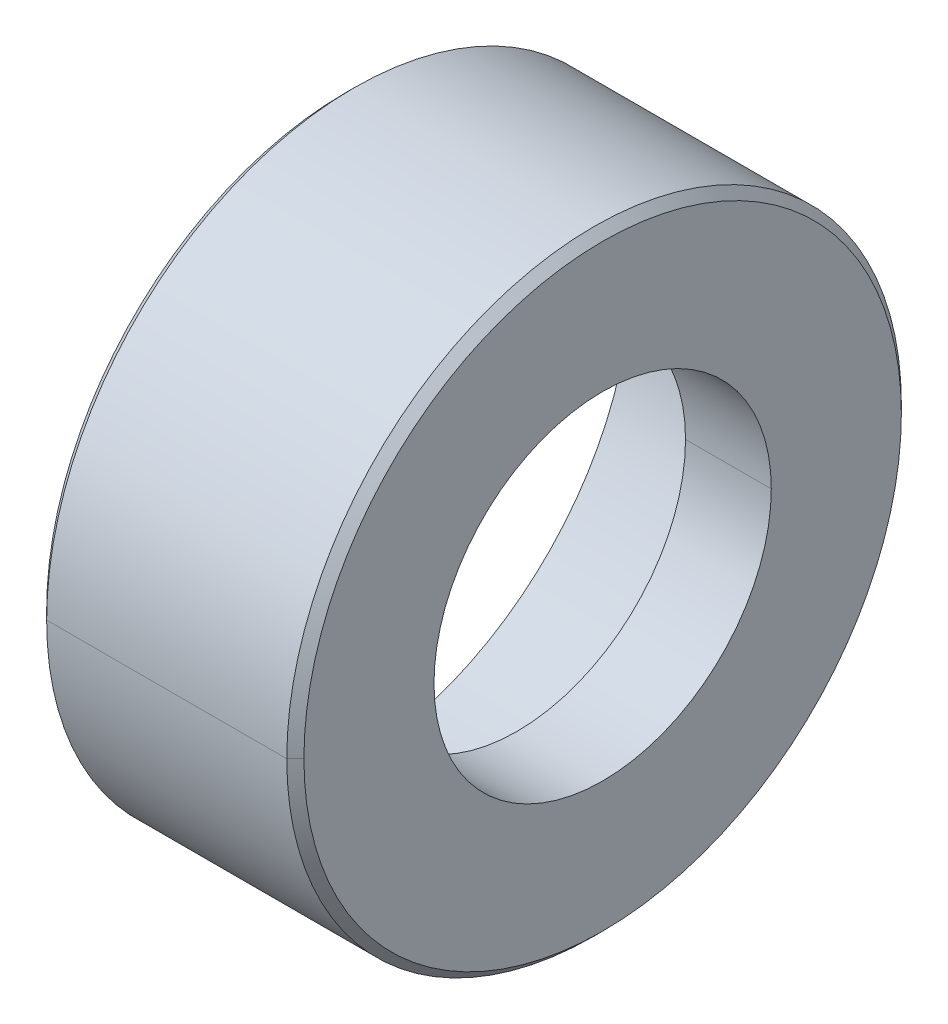
ISO-10303-21;
HEADER;
FILE_DESCRIPTION(('STEP AP214'),'2;1');
FILE_NAME('part.step','',(''),(''),'','','');
FILE_SCHEMA(('AUTOMOTIVE_DESIGN { 1 0 10303 214 1 1 1 1 }'));
ENDSEC;
DATA;
#1=APPLICATION_CONTEXT('core data for automotive mechanical design processes');
#2=APPLICATION_PROTOCOL_DEFINITION('international standard','automotive_design',2000,#1);
#3=PRODUCT_CONTEXT('',#1,'mechanical');
#4=PRODUCT('Part','Part','',(#3));
#5=PRODUCT_RELATED_PRODUCT_CATEGORY('part','',(#4));
#6=PRODUCT_DEFINITION_FORMATION('','',#4);
#7=PRODUCT_DEFINITION_CONTEXT('part definition',#1,'design');
#8=PRODUCT_DEFINITION('design','',#6,#7);
#9=PRODUCT_DEFINITION_SHAPE('','',#8);
#10=(LENGTH_UNIT() NAMED_UNIT(*) SI_UNIT(.MILLI.,.METRE.));
#11=(NAMED_UNIT(*) PLANE_ANGLE_UNIT() SI_UNIT($,.RADIAN.));
#12=(NAMED_UNIT(*) SI_UNIT($,.STERADIAN.) SOLID_ANGLE_UNIT());
#13=UNCERTAINTY_MEASURE_WITH_UNIT(LENGTH_MEASURE(1.E-05),#10,'distance_accuracy_value','');
#14=(GEOMETRIC_REPRESENTATION_CONTEXT(3) GLOBAL_UNCERTAINTY_ASSIGNED_CONTEXT((#13)) GLOBAL_UNIT_ASSIGNED_CONTEXT((#10,
#11,#12)) REPRESENTATION_CONTEXT('',''));
#15=CARTESIAN_POINT('',(0.,0.,0.));
#16=DIRECTION('',(0.,0.,1.));
#17=DIRECTION('',(1.,0.,0.));
#18=AXIS2_PLACEMENT_3D('',#15,#16,#17);
#19=CARTESIAN_POINT('',(9.00000000001464,0.,0.));
#20=DIRECTION('',(1.,0.,0.));
#21=DIRECTION('',(0.,0.,-1.));
#22=AXIS2_PLACEMENT_3D('',#19,#20,#21);
#23=CYLINDRICAL_SURFACE('',#22,5.9);
#24=DIRECTION('',(1.,0.,0.));
#25=VECTOR('',#24,1.);
#26=CARTESIAN_POINT('',(9.00000000001464,0.,5.9));
#27=LINE('',#26,#25);
#28=CARTESIAN_POINT('',(6.00000000001444,0.,5.9));
#29=VERTEX_POINT('',#28);
#30=CARTESIAN_POINT('',(9.00000000001464,0.,5.9));
#31=VERTEX_POINT('',#30);
#32=EDGE_CURVE('E108',#29,#31,#27,.T.);
#33=ORIENTED_EDGE('',*,*,#32,.F.);
#34=CARTESIAN_POINT('',(6.00000000001444,0.,0.));
#35=DIRECTION('',(1.,0.,0.));
#36=DIRECTION('',(0.,0.,-1.));
#37=AXIS2_PLACEMENT_3D('',#34,#35,#36);
#38=CIRCLE('',#37,5.9);
#39=CARTESIAN_POINT('',(6.00000000001444,0.,-5.9));
#40=VERTEX_POINT('',#39);
#41=EDGE_CURVE('E11',#40,#29,#38,.T.);
#42=ORIENTED_EDGE('',*,*,#41,.F.);
#43=DIRECTION('',(1.,0.,0.));
#44=VECTOR('',#43,1.);
#45=CARTESIAN_POINT('',(9.00000000001464,0.,-5.9));
#46=LINE('',#45,#44);
#47=CARTESIAN_POINT('',(9.00000000001464,0.,-5.9));
#48=VERTEX_POINT('',#47);
#49=EDGE_CURVE('E105',#40,#48,#46,.T.);
#50=ORIENTED_EDGE('',*,*,#49,.T.);
#51=CARTESIAN_POINT('',(9.00000000001464,0.,0.));
#52=DIRECTION('',(1.,0.,0.));
#53=DIRECTION('',(0.,0.,-1.));
#54=AXIS2_PLACEMENT_3D('',#51,#52,#53);
#55=CIRCLE('',#54,5.9);
#56=EDGE_CURVE('E21',#48,#31,#55,.T.);
#57=ORIENTED_EDGE('',*,*,#56,.T.);
#58=EDGE_LOOP('',(#33,#42,#50,#57));
#59=FACE_BOUND('',#58,.T.);
#60=ADVANCED_FACE('F17',(#59),#23,.F.);
#61=CARTESIAN_POINT('',(6.00000000001444,7.79927499549005,0.));
#62=DIRECTION('',(1.,0.,0.));
#63=DIRECTION('',(0.,1.,0.));
#64=AXIS2_PLACEMENT_3D('',#61,#62,#63);
#65=PLANE('',#64);
#66=ORIENTED_EDGE('',*,*,#41,.T.);
#67=CARTESIAN_POINT('',(6.00000000001444,0.,0.));
#68=DIRECTION('',(1.,0.,0.));
#69=DIRECTION('',(0.,0.,-1.));
#70=AXIS2_PLACEMENT_3D('',#67,#68,#69);
#71=CIRCLE('',#70,5.9);
#72=EDGE_CURVE('E114',#29,#40,#71,.T.);
#73=ORIENTED_EDGE('',*,*,#72,.T.);
#74=EDGE_LOOP('',(#66,#73));
#75=FACE_BOUND('',#74,.T.);
#76=CARTESIAN_POINT('',(6.00000000001444,-3.55272553789514E-12,0.));
#77=DIRECTION('',(-1.,0.,0.));
#78=DIRECTION('',(0.,0.,1.));
#79=AXIS2_PLACEMENT_3D('',#76,#77,#78);
#80=CIRCLE('',#79,7.7992749954936);
#81=CARTESIAN_POINT('',(6.00000000001444,-3.55272553789514E-12,7.7992749954936));
#82=VERTEX_POINT('',#81);
#83=CARTESIAN_POINT('',(6.00000000001444,-3.55177040217925E-12,-7.7992749954936));
#84=VERTEX_POINT('',#83);
#85=EDGE_CURVE('E229',#82,#84,#80,.T.);
#86=ORIENTED_EDGE('',*,*,#85,.T.);
#87=CARTESIAN_POINT('',(6.00000000001444,-3.55272553789514E-12,0.));
#88=DIRECTION('',(-1.,0.,0.));
#89=DIRECTION('',(0.,0.,1.));
#90=AXIS2_PLACEMENT_3D('',#87,#88,#89);
#91=CIRCLE('',#90,7.7992749954936);
#92=EDGE_CURVE('E28',#84,#82,#91,.T.);
#93=ORIENTED_EDGE('',*,*,#92,.T.);
#94=EDGE_LOOP('',(#86,#93));
#95=FACE_BOUND('',#94,.T.);
#96=ADVANCED_FACE('F19',(#75,#95),#65,.F.);
#97=CARTESIAN_POINT('',(-1.99999999998535,-3.55272553789514E-12,0.));
#98=DIRECTION('',(-1.,0.,0.));
#99=DIRECTION('',(0.,0.,1.));
#100=AXIS2_PLACEMENT_3D('',#97,#98,#99);
#101=CYLINDRICAL_SURFACE('',#100,7.7992749954936);
#102=DIRECTION('',(-1.,0.,0.));
#103=VECTOR('',#102,1.);
#104=CARTESIAN_POINT('',(-1.99999999998535,-3.55177040217925E-12,-7.7992749954936));
#105=LINE('',#104,#103);
#106=CARTESIAN_POINT('',(7.10000000003497,-3.55177040217925E-12,-7.7992749954936));
#107=VERTEX_POINT('',#106);
#108=EDGE_CURVE('E233',#107,#84,#105,.T.);
#109=ORIENTED_EDGE('',*,*,#108,.F.);
#110=CARTESIAN_POINT('',(7.10000000003497,-3.55272553789514E-12,0.));
#111=DIRECTION('',(-1.,0.,0.));
#112=DIRECTION('',(0.,0.,1.));
#113=AXIS2_PLACEMENT_3D('',#110,#111,#112);
#114=CIRCLE('',#113,7.7992749954936);
#115=CARTESIAN_POINT('',(7.10000000003497,-3.55272553789514E-12,7.7992749954936));
#116=VERTEX_POINT('',#115);
#117=EDGE_CURVE('E217',#107,#116,#114,.T.);
#118=ORIENTED_EDGE('',*,*,#117,.T.);
#119=DIRECTION('',(-1.,0.,0.));
#120=VECTOR('',#119,1.);
#121=CARTESIAN_POINT('',(-1.99999999998535,-3.55272553789514E-12,7.7992749954936));
#122=LINE('',#121,#120);
#123=EDGE_CURVE('E186',#116,#82,#122,.T.);
#124=ORIENTED_EDGE('',*,*,#123,.T.);
#125=ORIENTED_EDGE('',*,*,#92,.F.);
#126=EDGE_LOOP('',(#109,#118,#124,#125));
#127=FACE_BOUND('',#126,.T.);
#128=ADVANCED_FACE('F269',(#127),#101,.T.);
#129=CARTESIAN_POINT('',(7.10000000003497,9.59927499549296,0.));
#130=DIRECTION('',(1.,0.,0.));
#131=DIRECTION('',(0.,1.,0.));
#132=AXIS2_PLACEMENT_3D('',#129,#130,#131);
#133=PLANE('',#132);
#134=CARTESIAN_POINT('',(7.10000000003497,-3.55272553789514E-12,0.));
#135=DIRECTION('',(-1.,0.,0.));
#136=DIRECTION('',(0.,0.,1.));
#137=AXIS2_PLACEMENT_3D('',#134,#135,#136);
#138=CIRCLE('',#137,7.7992749954936);
#139=EDGE_CURVE('E118',#116,#107,#138,.T.);
#140=ORIENTED_EDGE('',*,*,#139,.F.);
#141=ORIENTED_EDGE('',*,*,#117,.F.);
#142=EDGE_LOOP('',(#140,#141));
#143=FACE_BOUND('',#142,.T.);
#144=CARTESIAN_POINT('',(7.10000000003497,-3.55272553789514E-12,0.));
#145=DIRECTION('',(-1.,0.,0.));
#146=DIRECTION('',(0.,0.,1.));
#147=AXIS2_PLACEMENT_3D('',#144,#145,#146);
#148=CIRCLE('',#147,9.59927499549651);
#149=CARTESIAN_POINT('',(7.10000000003497,-3.55272553789514E-12,9.59927499549651));
#150=VERTEX_POINT('',#149);
#151=CARTESIAN_POINT('',(7.10000000003497,-3.55154996575541E-12,-9.59927499549651));
#152=VERTEX_POINT('',#151);
#153=EDGE_CURVE('E215',#150,#152,#148,.T.);
#154=ORIENTED_EDGE('',*,*,#153,.T.);
#155=CARTESIAN_POINT('',(7.10000000003497,-3.55272553789514E-12,0.));
#156=DIRECTION('',(-1.,0.,0.));
#157=DIRECTION('',(0.,0.,1.));
#158=AXIS2_PLACEMENT_3D('',#155,#156,#157);
#159=CIRCLE('',#158,9.59927499549651);
#160=EDGE_CURVE('E174',#152,#150,#159,.T.);
#161=ORIENTED_EDGE('',*,*,#160,.T.);
#162=EDGE_LOOP('',(#154,#161));
#163=FACE_BOUND('',#162,.T.);
#164=ADVANCED_FACE('F276',(#143,#163),#133,.F.);
#165=CARTESIAN_POINT('',(-1.99999999998535,-3.55272553789514E-12,0.));
#166=DIRECTION('',(-1.,0.,0.));
#167=DIRECTION('',(0.,0.,1.));
#168=AXIS2_PLACEMENT_3D('',#165,#166,#167);
#169=CYLINDRICAL_SURFACE('',#168,9.59927499549651);
#170=DIRECTION('',(-1.,0.,0.));
#171=VECTOR('',#170,1.);
#172=CARTESIAN_POINT('',(-1.99999999998535,-3.55154996575541E-12,-9.59927499549651));
#173=LINE('',#172,#171);
#174=CARTESIAN_POINT('',(6.00000000001444,-3.55154996575541E-12,-9.59927499549651));
#175=VERTEX_POINT('',#174);
#176=EDGE_CURVE('E170',#152,#175,#173,.T.);
#177=ORIENTED_EDGE('',*,*,#176,.F.);
#178=ORIENTED_EDGE('',*,*,#153,.F.);
#179=DIRECTION('',(-1.,0.,0.));
#180=VECTOR('',#179,1.);
#181=CARTESIAN_POINT('',(-1.99999999998535,-3.55272553789514E-12,9.59927499549651));
#182=LINE('',#181,#180);
#183=CARTESIAN_POINT('',(6.00000000001444,-3.55272553789514E-12,9.59927499549651));
#184=VERTEX_POINT('',#183);
#185=EDGE_CURVE('E149',#150,#184,#182,.T.);
#186=ORIENTED_EDGE('',*,*,#185,.T.);
#187=CARTESIAN_POINT('',(6.00000000001444,-3.55272553789514E-12,0.));
#188=DIRECTION('',(-1.,0.,0.));
#189=DIRECTION('',(0.,0.,1.));
#190=AXIS2_PLACEMENT_3D('',#187,#188,#189);
#191=CIRCLE('',#190,9.59927499549651);
#192=EDGE_CURVE('E159',#184,#175,#191,.T.);
#193=ORIENTED_EDGE('',*,*,#192,.T.);
#194=EDGE_LOOP('',(#177,#178,#186,#193));
#195=FACE_BOUND('',#194,.T.);
#196=ADVANCED_FACE('F287',(#195),#169,.F.);
#197=CARTESIAN_POINT('',(6.00000000001444,9.99999999999635,0.));
#198=DIRECTION('',(1.,0.,0.));
#199=DIRECTION('',(0.,1.,0.));
#200=AXIS2_PLACEMENT_3D('',#197,#198,#199);
#201=PLANE('',#200);
#202=ORIENTED_EDGE('',*,*,#192,.F.);
#203=CARTESIAN_POINT('',(6.00000000001444,-3.55272553789514E-12,0.));
#204=DIRECTION('',(-1.,0.,0.));
#205=DIRECTION('',(0.,0.,1.));
#206=AXIS2_PLACEMENT_3D('',#203,#204,#205);
#207=CIRCLE('',#206,9.59927499549651);
#208=EDGE_CURVE('E154',#175,#184,#207,.T.);
#209=ORIENTED_EDGE('',*,*,#208,.F.);
#210=EDGE_LOOP('',(#202,#209));
#211=FACE_BOUND('',#210,.T.);
#212=CARTESIAN_POINT('',(6.00000000001444,-3.55272553789514E-12,0.));
#213=DIRECTION('',(-1.,0.,0.));
#214=DIRECTION('',(0.,0.,1.));
#215=AXIS2_PLACEMENT_3D('',#212,#213,#214);
#216=CIRCLE('',#215,10.);
#217=CARTESIAN_POINT('',(6.00000000001444,-3.55272553789514E-12,10.));
#218=VERTEX_POINT('',#217);
#219=CARTESIAN_POINT('',(6.00000000001444,-3.551500891096E-12,-10.));
#220=VERTEX_POINT('',#219);
#221=EDGE_CURVE('E155',#218,#220,#216,.T.);
#222=ORIENTED_EDGE('',*,*,#221,.T.);
#223=CARTESIAN_POINT('',(6.00000000001444,-3.55272553789514E-12,0.));
#224=DIRECTION('',(-1.,0.,0.));
#225=DIRECTION('',(0.,0.,1.));
#226=AXIS2_PLACEMENT_3D('',#223,#224,#225);
#227=CIRCLE('',#226,10.);
#228=EDGE_CURVE('E153',#220,#218,#227,.T.);
#229=ORIENTED_EDGE('',*,*,#228,.T.);
#230=EDGE_LOOP('',(#222,#229));
#231=FACE_BOUND('',#230,.T.);
#232=ADVANCED_FACE('F297',(#211,#231),#201,.F.);
#233=CARTESIAN_POINT('',(-1.99999999998535,-3.55272553789514E-12,0.));
#234=DIRECTION('',(-1.,0.,0.));
#235=DIRECTION('',(0.,0.,1.));
#236=AXIS2_PLACEMENT_3D('',#233,#234,#235);
#237=CYLINDRICAL_SURFACE('',#236,10.);
#238=DIRECTION('',(-1.,0.,0.));
#239=VECTOR('',#238,1.);
#240=CARTESIAN_POINT('',(-1.99999999998535,-3.551500891096E-12,-10.));
#241=LINE('',#240,#239);
#242=CARTESIAN_POINT('',(1.48769885299771E-11,-3.551500891096E-12,-10.));
#243=VERTEX_POINT('',#242);
#244=EDGE_CURVE('E148',#220,#243,#241,.T.);
#245=ORIENTED_EDGE('',*,*,#244,.F.);
#246=ORIENTED_EDGE('',*,*,#221,.F.);
#247=DIRECTION('',(-1.,0.,0.));
#248=VECTOR('',#247,1.);
#249=CARTESIAN_POINT('',(-1.99999999998535,-3.55272553789514E-12,10.));
#250=LINE('',#249,#248);
#251=CARTESIAN_POINT('',(1.48769885299771E-11,-3.55272553789514E-12,10.));
#252=VERTEX_POINT('',#251);
#253=EDGE_CURVE('E140',#218,#252,#250,.T.);
#254=ORIENTED_EDGE('',*,*,#253,.T.);
#255=CARTESIAN_POINT('',(1.48769885299771E-11,-3.55272553789514E-12,0.));
#256=DIRECTION('',(-1.,0.,0.));
#257=DIRECTION('',(0.,0.,1.));
#258=AXIS2_PLACEMENT_3D('',#255,#256,#257);
#259=CIRCLE('',#258,10.);
#260=EDGE_CURVE('E160',#252,#243,#259,.T.);
#261=ORIENTED_EDGE('',*,*,#260,.T.);
#262=EDGE_LOOP('',(#245,#246,#254,#261));
#263=FACE_BOUND('',#262,.T.);
#264=ADVANCED_FACE('F325',(#263),#237,.F.);
#265=CARTESIAN_POINT('',(1.48769826004298E-11,10.4500000000007,0.));
#266=DIRECTION('',(1.,0.,0.));
#267=DIRECTION('',(0.,1.,0.));
#268=AXIS2_PLACEMENT_3D('',#265,#266,#267);
#269=PLANE('',#268);
#270=ORIENTED_EDGE('',*,*,#260,.F.);
#271=CARTESIAN_POINT('',(1.48769885299771E-11,-3.55272553789514E-12,0.));
#272=DIRECTION('',(-1.,0.,0.));
#273=DIRECTION('',(0.,0.,1.));
#274=AXIS2_PLACEMENT_3D('',#271,#272,#273);
#275=CIRCLE('',#274,10.);
#276=EDGE_CURVE('E144',#243,#252,#275,.T.);
#277=ORIENTED_EDGE('',*,*,#276,.F.);
#278=EDGE_LOOP('',(#270,#277));
#279=FACE_BOUND('',#278,.T.);
#280=CARTESIAN_POINT('',(1.48769885299771E-11,-3.55272553789514E-12,0.));
#281=DIRECTION('',(-1.,0.,0.));
#282=DIRECTION('',(0.,0.,1.));
#283=AXIS2_PLACEMENT_3D('',#280,#281,#282);
#284=CIRCLE('',#283,10.4500000000043);
#285=CARTESIAN_POINT('',(1.48769885299771E-11,-3.55272553789514E-12,-10.4500000000043));
#286=VERTEX_POINT('',#285);
#287=CARTESIAN_POINT('',(1.48769885299771E-11,-3.55142741228805E-12,10.4500000000043));
#288=VERTEX_POINT('',#287);
#289=EDGE_CURVE('E142',#286,#288,#284,.T.);
#290=ORIENTED_EDGE('',*,*,#289,.T.);
#291=CARTESIAN_POINT('',(1.48769885299771E-11,-3.55272553789514E-12,0.));
#292=DIRECTION('',(-1.,0.,0.));
#293=DIRECTION('',(0.,0.,1.));
#294=AXIS2_PLACEMENT_3D('',#291,#292,#293);
#295=CIRCLE('',#294,10.4500000000043);
#296=EDGE_CURVE('E135',#288,#286,#295,.T.);
#297=ORIENTED_EDGE('',*,*,#296,.T.);
#298=EDGE_LOOP('',(#290,#297));
#299=FACE_BOUND('',#298,.T.);
#300=ADVANCED_FACE('F312',(#279,#299),#269,.F.);
#301=CARTESIAN_POINT('',(0.300000000010569,-3.55272553789514E-12,0.));
#302=DIRECTION('',(1.,0.,0.));
#303=DIRECTION('',(0.,0.,-1.));
#304=AXIS2_PLACEMENT_3D('',#301,#302,#303);
#305=CONICAL_SURFACE('',#304,10.75,0.785398163397448);
#306=DIRECTION('',(0.707106781186548,0.,0.707106781186548));
#307=VECTOR('',#306,1.);
#308=CARTESIAN_POINT('',(0.300000000010569,-3.55140904258606E-12,10.75));
#309=LINE('',#308,#307);
#310=CARTESIAN_POINT('',(0.300000000010569,-3.55272553789514E-12,10.75));
#311=VERTEX_POINT('',#310);
#312=EDGE_CURVE('E139',#288,#311,#309,.T.);
#313=ORIENTED_EDGE('',*,*,#312,.F.);
#314=ORIENTED_EDGE('',*,*,#289,.F.);
#315=DIRECTION('',(0.707106781186548,0.,-0.707106781186548));
#316=VECTOR('',#315,1.);
#317=CARTESIAN_POINT('',(0.300000000010569,-3.55272553789514E-12,-10.75));
#318=LINE('',#317,#316);
#319=CARTESIAN_POINT('',(0.300000000010569,-3.55140904258606E-12,-10.75));
#320=VERTEX_POINT('',#319);
#321=EDGE_CURVE('E169',#286,#320,#318,.T.);
#322=ORIENTED_EDGE('',*,*,#321,.T.);
#323=CARTESIAN_POINT('',(0.300000000010569,-3.55272553789514E-12,0.));
#324=DIRECTION('',(-1.,0.,0.));
#325=DIRECTION('',(0.,0.,1.));
#326=AXIS2_PLACEMENT_3D('',#323,#324,#325);
#327=CIRCLE('',#326,10.75);
#328=EDGE_CURVE('E134',#320,#311,#327,.T.);
#329=ORIENTED_EDGE('',*,*,#328,.T.);
#330=EDGE_LOOP('',(#313,#314,#322,#329));
#331=FACE_BOUND('',#330,.T.);
#332=ADVANCED_FACE('F324',(#331),#305,.T.);
#333=CARTESIAN_POINT('',(-1.99999999998535,-3.55272553789514E-12,0.));
#334=DIRECTION('',(-1.,0.,0.));
#335=DIRECTION('',(0.,0.,1.));
#336=AXIS2_PLACEMENT_3D('',#333,#334,#335);
#337=CYLINDRICAL_SURFACE('',#336,10.75);
#338=DIRECTION('',(-1.,0.,0.));
#339=VECTOR('',#338,1.);
#340=CARTESIAN_POINT('',(-1.99999999998535,-3.55140904258606E-12,-10.75));
#341=LINE('',#340,#339);
#342=CARTESIAN_POINT('',(8.70000000001181,-3.55140904258606E-12,-10.75));
#343=VERTEX_POINT('',#342);
#344=EDGE_CURVE('E168',#343,#320,#341,.T.);
#345=ORIENTED_EDGE('',*,*,#344,.F.);
#346=CARTESIAN_POINT('',(8.70000000001181,-3.55272553789514E-12,0.));
#347=DIRECTION('',(-1.,0.,0.));
#348=DIRECTION('',(0.,0.,1.));
#349=AXIS2_PLACEMENT_3D('',#346,#347,#348);
#350=CIRCLE('',#349,10.75);
#351=CARTESIAN_POINT('',(8.70000000001181,-3.55272553789514E-12,10.75));
#352=VERTEX_POINT('',#351);
#353=EDGE_CURVE('E132',#343,#352,#350,.T.);
#354=ORIENTED_EDGE('',*,*,#353,.T.);
#355=DIRECTION('',(-1.,0.,0.));
#356=VECTOR('',#355,1.);
#357=CARTESIAN_POINT('',(-1.99999999998535,-3.55272553789514E-12,10.75));
#358=LINE('',#357,#356);
#359=EDGE_CURVE('E189',#352,#311,#358,.T.);
#360=ORIENTED_EDGE('',*,*,#359,.T.);
#361=ORIENTED_EDGE('',*,*,#328,.F.);
#362=EDGE_LOOP('',(#345,#354,#360,#361));
#363=FACE_BOUND('',#362,.T.);
#364=ADVANCED_FACE('F320',(#363),#337,.T.);
#365=CARTESIAN_POINT('',(9.00000000001464,-3.55272553789514E-12,0.));
#366=DIRECTION('',(-1.,0.,0.));
#367=DIRECTION('',(0.,0.,1.));
#368=AXIS2_PLACEMENT_3D('',#365,#366,#367);
#369=CONICAL_SURFACE('',#368,10.4499999999972,0.785398163397448);
#370=DIRECTION('',(-0.707106781186548,0.,-0.707106781186548));
#371=VECTOR('',#370,1.);
#372=CARTESIAN_POINT('',(9.00000000001464,-3.55144578199004E-12,-10.4499999999972));
#373=LINE('',#372,#371);
#374=CARTESIAN_POINT('',(9.00000000001464,-3.55142741228805E-12,-10.4499999999972));
#375=VERTEX_POINT('',#374);
#376=EDGE_CURVE('E207',#375,#343,#373,.T.);
#377=ORIENTED_EDGE('',*,*,#376,.F.);
#378=CARTESIAN_POINT('',(9.00000000001464,-3.55272553789514E-12,0.));
#379=DIRECTION('',(-1.,0.,0.));
#380=DIRECTION('',(0.,0.,1.));
#381=AXIS2_PLACEMENT_3D('',#378,#379,#380);
#382=CIRCLE('',#381,10.4499999999972);
#383=CARTESIAN_POINT('',(9.00000000001464,-3.55272553789514E-12,10.4499999999972));
#384=VERTEX_POINT('',#383);
#385=EDGE_CURVE('E42',#375,#384,#382,.T.);
#386=ORIENTED_EDGE('',*,*,#385,.T.);
#387=DIRECTION('',(-0.707106781186548,0.,0.707106781186548));
#388=VECTOR('',#387,1.);
#389=CARTESIAN_POINT('',(9.00000000001464,-3.55272553789514E-12,10.4499999999972));
#390=LINE('',#389,#388);
#391=EDGE_CURVE('E227',#384,#352,#390,.T.);
#392=ORIENTED_EDGE('',*,*,#391,.T.);
#393=ORIENTED_EDGE('',*,*,#353,.F.);
#394=EDGE_LOOP('',(#377,#386,#392,#393));
#395=FACE_BOUND('',#394,.T.);
#396=ADVANCED_FACE('F293',(#395),#369,.T.);
#397=CARTESIAN_POINT('',(9.00000000001464,-3.55272553789514E-12,0.));
#398=DIRECTION('',(-1.,0.,0.));
#399=DIRECTION('',(0.,0.,1.));
#400=AXIS2_PLACEMENT_3D('',#397,#398,#399);
#401=PLANE('',#400);
#402=ORIENTED_EDGE('',*,*,#56,.F.);
#403=CARTESIAN_POINT('',(9.00000000001464,0.,0.));
#404=DIRECTION('',(1.,0.,0.));
#405=DIRECTION('',(0.,0.,-1.));
#406=AXIS2_PLACEMENT_3D('',#403,#404,#405);
#407=CIRCLE('',#406,5.9);
#408=EDGE_CURVE('E116',#31,#48,#407,.T.);
#409=ORIENTED_EDGE('',*,*,#408,.F.);
#410=EDGE_LOOP('',(#402,#409));
#411=FACE_BOUND('',#410,.T.);
#412=CARTESIAN_POINT('',(9.00000000001464,-3.55272553789514E-12,0.));
#413=DIRECTION('',(-1.,0.,0.));
#414=DIRECTION('',(0.,0.,1.));
#415=AXIS2_PLACEMENT_3D('',#412,#413,#414);
#416=CIRCLE('',#415,10.4499999999972);
#417=EDGE_CURVE('E198',#384,#375,#416,.T.);
#418=ORIENTED_EDGE('',*,*,#417,.F.);
#419=ORIENTED_EDGE('',*,*,#385,.F.);
#420=EDGE_LOOP('',(#418,#419));
#421=FACE_BOUND('',#420,.T.);
#422=ADVANCED_FACE('F289',(#411,#421),#401,.F.);
#423=CARTESIAN_POINT('',(9.00000000001464,-3.55272553789514E-12,0.));
#424=DIRECTION('',(-1.,0.,0.));
#425=DIRECTION('',(0.,0.,1.));
#426=AXIS2_PLACEMENT_3D('',#423,#424,#425);
#427=CONICAL_SURFACE('',#426,10.4499999999972,0.785398163397448);
#428=ORIENTED_EDGE('',*,*,#417,.T.);
#429=ORIENTED_EDGE('',*,*,#376,.T.);
#430=CARTESIAN_POINT('',(8.70000000001181,-3.55272553789514E-12,0.));
#431=DIRECTION('',(-1.,0.,0.));
#432=DIRECTION('',(0.,0.,1.));
#433=AXIS2_PLACEMENT_3D('',#430,#431,#432);
#434=CIRCLE('',#433,10.75);
#435=EDGE_CURVE('E164',#352,#343,#434,.T.);
#436=ORIENTED_EDGE('',*,*,#435,.F.);
#437=ORIENTED_EDGE('',*,*,#391,.F.);
#438=EDGE_LOOP('',(#428,#429,#436,#437));
#439=FACE_BOUND('',#438,.T.);
#440=ADVANCED_FACE('F292',(#439),#427,.T.);
#441=CARTESIAN_POINT('',(-1.99999999998535,-3.55272553789514E-12,0.));
#442=DIRECTION('',(-1.,0.,0.));
#443=DIRECTION('',(0.,0.,1.));
#444=AXIS2_PLACEMENT_3D('',#441,#442,#443);
#445=CYLINDRICAL_SURFACE('',#444,10.75);
#446=ORIENTED_EDGE('',*,*,#435,.T.);
#447=ORIENTED_EDGE('',*,*,#344,.T.);
#448=CARTESIAN_POINT('',(0.300000000010569,-3.55272553789514E-12,0.));
#449=DIRECTION('',(-1.,0.,0.));
#450=DIRECTION('',(0.,0.,1.));
#451=AXIS2_PLACEMENT_3D('',#448,#449,#450);
#452=CIRCLE('',#451,10.75);
#453=EDGE_CURVE('E178',#311,#320,#452,.T.);
#454=ORIENTED_EDGE('',*,*,#453,.F.);
#455=ORIENTED_EDGE('',*,*,#359,.F.);
#456=EDGE_LOOP('',(#446,#447,#454,#455));
#457=FACE_BOUND('',#456,.T.);
#458=ADVANCED_FACE('F316',(#457),#445,.T.);
#459=CARTESIAN_POINT('',(0.300000000010569,-3.55272553789514E-12,0.));
#460=DIRECTION('',(1.,0.,0.));
#461=DIRECTION('',(0.,0.,-1.));
#462=AXIS2_PLACEMENT_3D('',#459,#460,#461);
#463=CONICAL_SURFACE('',#462,10.75,0.785398163397448);
#464=ORIENTED_EDGE('',*,*,#296,.F.);
#465=ORIENTED_EDGE('',*,*,#312,.T.);
#466=ORIENTED_EDGE('',*,*,#453,.T.);
#467=ORIENTED_EDGE('',*,*,#321,.F.);
#468=EDGE_LOOP('',(#464,#465,#466,#467));
#469=FACE_BOUND('',#468,.T.);
#470=ADVANCED_FACE('F283',(#469),#463,.T.);
#471=CARTESIAN_POINT('',(-1.99999999998535,-3.55272553789514E-12,0.));
#472=DIRECTION('',(-1.,0.,0.));
#473=DIRECTION('',(0.,0.,1.));
#474=AXIS2_PLACEMENT_3D('',#471,#472,#473);
#475=CYLINDRICAL_SURFACE('',#474,10.);
#476=ORIENTED_EDGE('',*,*,#228,.F.);
#477=ORIENTED_EDGE('',*,*,#244,.T.);
#478=ORIENTED_EDGE('',*,*,#276,.T.);
#479=ORIENTED_EDGE('',*,*,#253,.F.);
#480=EDGE_LOOP('',(#476,#477,#478,#479));
#481=FACE_BOUND('',#480,.T.);
#482=ADVANCED_FACE('F301',(#481),#475,.F.);
#483=CARTESIAN_POINT('',(-1.99999999998535,-3.55272553789514E-12,0.));
#484=DIRECTION('',(-1.,0.,0.));
#485=DIRECTION('',(0.,0.,1.));
#486=AXIS2_PLACEMENT_3D('',#483,#484,#485);
#487=CYLINDRICAL_SURFACE('',#486,9.59927499549651);
#488=ORIENTED_EDGE('',*,*,#160,.F.);
#489=ORIENTED_EDGE('',*,*,#176,.T.);
#490=ORIENTED_EDGE('',*,*,#208,.T.);
#491=ORIENTED_EDGE('',*,*,#185,.F.);
#492=EDGE_LOOP('',(#488,#489,#490,#491));
#493=FACE_BOUND('',#492,.T.);
#494=ADVANCED_FACE('F299',(#493),#487,.F.);
#495=CARTESIAN_POINT('',(-1.99999999998535,-3.55272553789514E-12,0.));
#496=DIRECTION('',(-1.,0.,0.));
#497=DIRECTION('',(0.,0.,1.));
#498=AXIS2_PLACEMENT_3D('',#495,#496,#497);
#499=CYLINDRICAL_SURFACE('',#498,7.7992749954936);
#500=ORIENTED_EDGE('',*,*,#139,.T.);
#501=ORIENTED_EDGE('',*,*,#108,.T.);
#502=ORIENTED_EDGE('',*,*,#85,.F.);
#503=ORIENTED_EDGE('',*,*,#123,.F.);
#504=EDGE_LOOP('',(#500,#501,#502,#503));
#505=FACE_BOUND('',#504,.T.);
#506=ADVANCED_FACE('F262',(#505),#499,.T.);
#507=CARTESIAN_POINT('',(9.00000000001464,0.,0.));
#508=DIRECTION('',(1.,0.,0.));
#509=DIRECTION('',(0.,0.,-1.));
#510=AXIS2_PLACEMENT_3D('',#507,#508,#509);
#511=CYLINDRICAL_SURFACE('',#510,5.9);
#512=ORIENTED_EDGE('',*,*,#72,.F.);
#513=ORIENTED_EDGE('',*,*,#32,.T.);
#514=ORIENTED_EDGE('',*,*,#408,.T.);
#515=ORIENTED_EDGE('',*,*,#49,.F.);
#516=EDGE_LOOP('',(#512,#513,#514,#515));
#517=FACE_BOUND('',#516,.T.);
#518=ADVANCED_FACE('F113',(#517),#511,.F.);
#519=CLOSED_SHELL('',(#60,#96,#128,#164,#196,#232,#264,#300,#332,#364,#396,#422,#440,#458,#470,
#482,#494,#506,#518));
#520=MANIFOLD_SOLID_BREP('B1',#519);
#521=ADVANCED_BREP_SHAPE_REPRESENTATION('',(#18,#520),#14);
#522=SHAPE_DEFINITION_REPRESENTATION(#9,#521);
ENDSEC;
END-ISO-10303-21;
